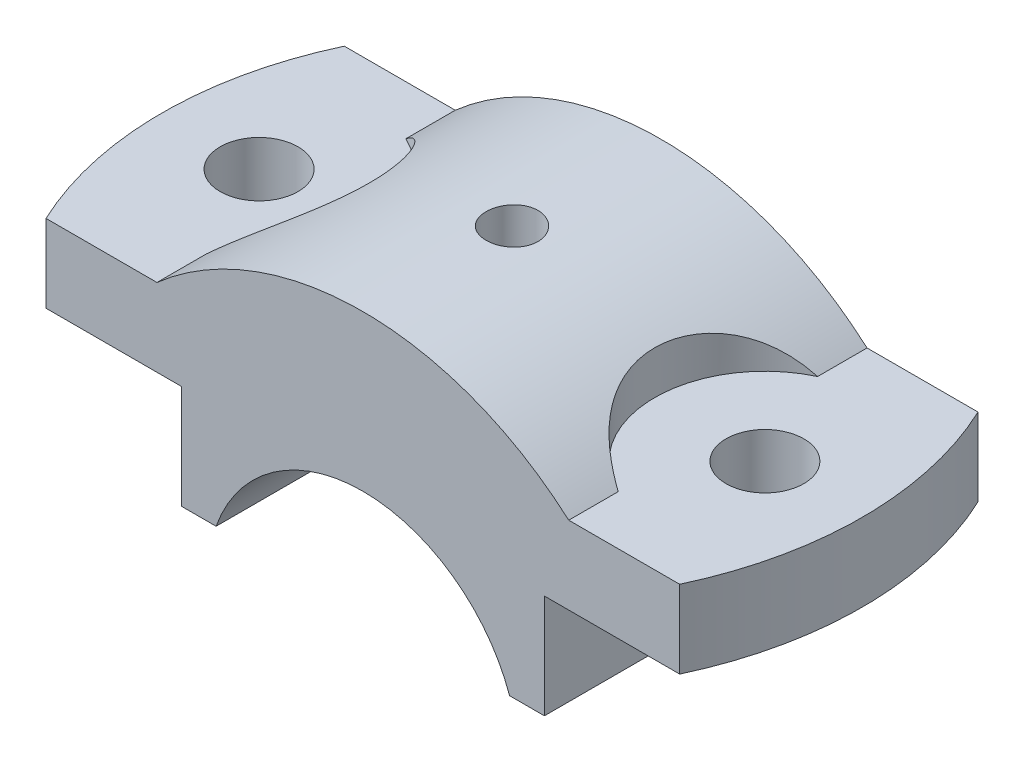
ISO-10303-21;
HEADER;
FILE_DESCRIPTION(('STEP AP214'),'2;1');
FILE_NAME('part.step','',(''),(''),'','','');
FILE_SCHEMA(('AUTOMOTIVE_DESIGN { 1 0 10303 214 1 1 1 1 }'));
ENDSEC;
DATA;
#1=APPLICATION_CONTEXT('core data for automotive mechanical design processes');
#2=APPLICATION_PROTOCOL_DEFINITION('international standard','automotive_design',2000,#1);
#3=PRODUCT_CONTEXT('',#1,'mechanical');
#4=PRODUCT('Part','Part','',(#3));
#5=PRODUCT_RELATED_PRODUCT_CATEGORY('part','',(#4));
#6=PRODUCT_DEFINITION_FORMATION('','',#4);
#7=PRODUCT_DEFINITION_CONTEXT('part definition',#1,'design');
#8=PRODUCT_DEFINITION('design','',#6,#7);
#9=PRODUCT_DEFINITION_SHAPE('','',#8);
#10=(LENGTH_UNIT() NAMED_UNIT(*) SI_UNIT(.MILLI.,.METRE.));
#11=(NAMED_UNIT(*) PLANE_ANGLE_UNIT() SI_UNIT($,.RADIAN.));
#12=(NAMED_UNIT(*) SI_UNIT($,.STERADIAN.) SOLID_ANGLE_UNIT());
#13=UNCERTAINTY_MEASURE_WITH_UNIT(LENGTH_MEASURE(1.E-05),#10,'distance_accuracy_value','');
#14=(GEOMETRIC_REPRESENTATION_CONTEXT(3) GLOBAL_UNCERTAINTY_ASSIGNED_CONTEXT((#13)) GLOBAL_UNIT_ASSIGNED_CONTEXT((#10,
#11,#12)) REPRESENTATION_CONTEXT('',''));
#15=CARTESIAN_POINT('',(0.,0.,0.));
#16=DIRECTION('',(0.,0.,1.));
#17=DIRECTION('',(1.,0.,0.));
#18=AXIS2_PLACEMENT_3D('',#15,#16,#17);
#19=CARTESIAN_POINT('',(0.,0.,23.));
#20=DIRECTION('',(0.,0.,-1.));
#21=DIRECTION('',(-1.,0.,0.));
#22=AXIS2_PLACEMENT_3D('',#19,#20,#21);
#23=CYLINDRICAL_SURFACE('',#22,48.0000000000001);
#24=CARTESIAN_POINT('',(0.,48.0000000000001,-4.));
#25=CARTESIAN_POINT('',(0.224264359684817,47.9999978164607,-3.99999020469488));
#26=CARTESIAN_POINT('',(0.448681388720902,47.9984115417359,-3.98107612075582));
#27=CARTESIAN_POINT('',(0.891306282801559,47.9922360931301,-3.90590259257969));
#28=CARTESIAN_POINT('',(1.10950682090092,47.9876435172678,-3.84960083878039));
#29=CARTESIAN_POINT('',(1.53322409005704,47.9759744498442,-3.70129138476253));
#30=CARTESIAN_POINT('',(1.73874792169846,47.9688993639395,-3.60930388756073));
#31=CARTESIAN_POINT('',(2.1313889336643,47.9530587097885,-3.39227027251202));
#32=CARTESIAN_POINT('',(2.31851003954155,47.9442935032544,-3.26723122608997));
#33=CARTESIAN_POINT('',(2.66955999986236,47.9260311946686,-2.98729973357602));
#34=CARTESIAN_POINT('',(2.83343548966464,47.9165324834631,-2.83234046425726));
#35=CARTESIAN_POINT('',(3.13288453414622,47.8978872321268,-2.49710841660027));
#36=CARTESIAN_POINT('',(3.26845684548602,47.8887407074816,-2.31683452678951));
#37=CARTESIAN_POINT('',(3.50763168956092,47.8718181064498,-1.93576753160389));
#38=CARTESIAN_POINT('',(3.61118733180617,47.8640440472037,-1.73494489838891));
#39=CARTESIAN_POINT('',(3.78308973509538,47.850764977931,-1.31868681777607));
#40=CARTESIAN_POINT('',(3.85143711804967,47.8452599278253,-1.103251628567));
#41=CARTESIAN_POINT('',(3.95082811927428,47.8371556826529,-0.66441843247529));
#42=CARTESIAN_POINT('',(3.9819586615591,47.8345497174488,-0.441040240029592));
#43=CARTESIAN_POINT('',(4.00630083206171,47.8325172928591,0.00778481578146288));
#44=CARTESIAN_POINT('',(3.99951317191816,47.8330907738025,0.233231640244011));
#45=CARTESIAN_POINT('',(3.94828345685939,47.8373462944655,0.679198662042085));
#46=CARTESIAN_POINT('',(3.90393587215223,47.8410205351142,0.899729796305649));
#47=CARTESIAN_POINT('',(3.77899194153176,47.8510513427747,1.33020746957181));
#48=CARTESIAN_POINT('',(3.69839524158714,47.857407935984,1.54015390517541));
#49=CARTESIAN_POINT('',(3.50313515260813,47.8720961882742,1.94380362351239));
#50=CARTESIAN_POINT('',(3.38842937902878,47.8804303020386,2.13748631035003));
#51=CARTESIAN_POINT('',(3.12823777565339,47.8981322745552,2.50288535527922));
#52=CARTESIAN_POINT('',(2.98275132249017,47.9075001542413,2.67460126838886));
#53=CARTESIAN_POINT('',(2.66459832890545,47.9262488164658,2.99174167712627));
#54=CARTESIAN_POINT('',(2.4918501175623,47.9356295510027,3.13708425651701));
#55=CARTESIAN_POINT('',(2.124362225487,47.9533196747934,3.39671889355421));
#56=CARTESIAN_POINT('',(1.92962253006135,47.9616290633315,3.51101093045423));
#57=CARTESIAN_POINT('',(1.52362637307141,47.9762418323856,3.70529505067482));
#58=CARTESIAN_POINT('',(1.3123681672363,47.9825450006978,3.78528350591262));
#59=CARTESIAN_POINT('',(0.879356276078327,47.992432696472,3.90863252980531));
#60=CARTESIAN_POINT('',(0.65760280867542,47.9960172803555,3.95199385862105));
#61=CARTESIAN_POINT('',(0.210605200657004,48.0000566777221,4.00075505616631));
#62=CARTESIAN_POINT('',(-0.0146265164607844,48.0005208196801,4.00626807242759));
#63=CARTESIAN_POINT('',(-0.462811010013214,47.9982919511481,3.97947255749074));
#64=CARTESIAN_POINT('',(-0.685763807685653,47.995598970107,3.94716437908216));
#65=CARTESIAN_POINT('',(-1.1227390248988,47.9873647136529,3.84573736555962));
#66=CARTESIAN_POINT('',(-1.33677370055889,47.9818274966969,3.77667097589676));
#67=CARTESIAN_POINT('',(-1.75021666032996,47.9685268044941,3.60374164887188));
#68=CARTESIAN_POINT('',(-1.94962471313253,47.9607632940497,3.499878161366));
#69=CARTESIAN_POINT('',(-2.32866887320763,47.9438570557453,3.26001860313458));
#70=CARTESIAN_POINT('',(-2.50825740208588,47.9347111287495,3.12394757442069));
#71=CARTESIAN_POINT('',(-2.84208437937449,47.916078345588,2.82364377179807));
#72=CARTESIAN_POINT('',(-2.99632238725753,47.9065914835011,2.65941050860293));
#73=CARTESIAN_POINT('',(-3.27545818182041,47.8883184486329,2.30695323120664));
#74=CARTESIAN_POINT('',(-3.40028213293455,47.879534074969,2.1186706352104));
#75=CARTESIAN_POINT('',(-3.61654025135807,47.8636860697729,1.72375094854634));
#76=CARTESIAN_POINT('',(-3.70797475203986,47.8566224210607,1.51711404116025));
#77=CARTESIAN_POINT('',(-3.85473270976226,47.8450257139577,1.09161283784305));
#78=CARTESIAN_POINT('',(-3.91010136579716,47.8404894891454,0.872764221142677));
#79=CARTESIAN_POINT('',(-3.98330307964061,47.8344506276341,0.428837200502303));
#80=CARTESIAN_POINT('',(-4.00113685827306,47.8329479326788,0.20375891628162));
#81=CARTESIAN_POINT('',(-3.99875425156372,47.8331471180078,-0.245504504083583));
#82=CARTESIAN_POINT('',(-3.97865387910956,47.8348392277228,-0.469690268945752));
#83=CARTESIAN_POINT('',(-3.90121545318012,47.8412166032923,-0.911490134203405));
#84=CARTESIAN_POINT('',(-3.84387734291051,47.8459018737119,-1.12910422457536));
#85=CARTESIAN_POINT('',(-3.69362044006825,47.8577350852682,-1.55159105306648));
#86=CARTESIAN_POINT('',(-3.60070373602613,47.8648828818476,-1.75646453826275));
#87=CARTESIAN_POINT('',(-3.381940235789,47.8808359950028,-2.14772336229467));
#88=CARTESIAN_POINT('',(-3.25609395645823,47.889641285562,-2.3341089912533));
#89=CARTESIAN_POINT('',(-2.97460776848979,47.9079492679473,-2.68369495605204));
#90=CARTESIAN_POINT('',(-2.81888197496584,47.9174539202298,-2.84682603462939));
#91=CARTESIAN_POINT('',(-2.48221290236986,47.9360718003872,-3.14470074081328));
#92=CARTESIAN_POINT('',(-2.30126353056437,47.945184932993,-3.27943748998406));
#93=CARTESIAN_POINT('',(-1.91893509211766,47.962009393691,-3.51687944167025));
#94=CARTESIAN_POINT('',(-1.71751862508215,47.9697180809242,-3.61952455462531));
#95=CARTESIAN_POINT('',(-1.30038300798293,47.982834100652,-3.78940721220512));
#96=CARTESIAN_POINT('',(-1.0846806216546,47.9882440771303,-3.85668545715242));
#97=CARTESIAN_POINT('',(-0.723088192386717,47.9947643093541,-3.93679033000819));
#98=CARTESIAN_POINT('',(-0.579523577753882,47.9967187550782,-3.96046245006995));
#99=CARTESIAN_POINT('',(-0.290660686004651,47.9993373063454,-3.99207043870882));
#100=CARTESIAN_POINT('',(-0.145362413492181,48.0000014153143,-4.00000634906587));
#101=CARTESIAN_POINT('',(0.,48.0000000000001,-4.));
#102=B_SPLINE_CURVE_WITH_KNOTS('',3,(#24,#25,#26,#27,#28,#29,#30,#31,#32,#33,#34,#35,#36,#37,
#38,#39,#40,#41,#42,#43,#44,#45,#46,#47,#48,#49,#50,#51,#52,#53,#54,#55,#56,#57,#58,#59,#60,#61,
#62,#63,#64,#65,#66,#67,#68,#69,#70,#71,#72,#73,#74,#75,#76,#77,#78,#79,#80,#81,#82,#83,#84,#85,
#86,#87,#88,#89,#90,#91,#92,#93,#94,#95,#96,#97,#98,#99,#100,#101),.UNSPECIFIED.,.T.,.F.,(4,2,2,
2,2,2,2,2,2,2,2,2,2,2,2,2,2,2,2,2,2,2,2,2,2,2,2,2,2,2,2,2,2,2,2,2,2,2,4),(0.,0.672262347200557,
1.34528675599134,2.01793069555582,2.69043083833673,3.36445067514306,4.03850011495726,
4.71353211804365,5.38855219711604,6.06199259326346,6.73542035050476,7.40715932441158,
8.07890485907995,8.75148862995597,9.42408602323441,10.098738037406,10.7733905023458,
11.448114303618,12.1228241013014,12.7955159722867,13.4682015685688,14.1399299612314,
14.8116689744549,15.4849869989971,16.15831672285,16.8333190596481,17.5083146567931,
18.1824626896371,18.8565977759503,19.5286745153011,20.2007522796936,20.8727905979009,
21.5448183683942,22.2188075465856,22.8929598092992,23.5683669225022,24.2429950636714,
24.6787394542665,25.1144826879498),.UNSPECIFIED.);
#103=CARTESIAN_POINT('',(0.,48.0000000000001,-4.));
#104=VERTEX_POINT('',#103);
#105=EDGE_CURVE('E11',#104,#104,#102,.T.);
#106=ORIENTED_EDGE('',*,*,#105,.T.);
#107=EDGE_LOOP('',(#106));
#108=FACE_BOUND('',#107,.T.);
#109=CARTESIAN_POINT('',(31.7490157327752,36.,-15.376060196177));
#110=CARTESIAN_POINT('',(31.5666993606049,36.1607910344816,-15.2900831270757));
#111=CARTESIAN_POINT('',(31.3842407385664,36.3192382806886,-15.200076432177));
#112=CARTESIAN_POINT('',(31.0194382984915,36.6312986785064,-15.011755230729));
#113=CARTESIAN_POINT('',(30.83709449581,36.7849112802083,-14.9134397837672));
#114=CARTESIAN_POINT('',(30.2906545114745,37.2384242405059,-14.6055515958542));
#115=CARTESIAN_POINT('',(29.9273932433293,37.5307855559239,-14.3831506648985));
#116=CARTESIAN_POINT('',(29.2055877678829,38.0952057641667,-13.9017498917579));
#117=CARTESIAN_POINT('',(28.8470773519233,38.3671527207169,-13.6425680163447));
#118=CARTESIAN_POINT('',(28.1414563178619,38.8876660950045,-13.087906778826));
#119=CARTESIAN_POINT('',(27.7943424142726,39.1362392903487,-12.7924379963693));
#120=CARTESIAN_POINT('',(27.114437272857,39.6103537782901,-12.1634340928704));
#121=CARTESIAN_POINT('',(26.7817440960143,39.8357484531289,-11.8296819039898));
#122=CARTESIAN_POINT('',(26.1381758530123,40.2609560521936,-11.1265718110928));
#123=CARTESIAN_POINT('',(25.8273031949564,40.4607661549158,-10.7572099878547));
#124=CARTESIAN_POINT('',(25.2335249148575,40.8337098769774,-9.98600624775005));
#125=CARTESIAN_POINT('',(24.9505424988563,41.0069175240426,-9.58425938846317));
#126=CARTESIAN_POINT('',(24.4165226257608,41.3271148139076,-8.75027197863385));
#127=CARTESIAN_POINT('',(24.165480267083,41.4741084809499,-8.31803612285607));
#128=CARTESIAN_POINT('',(23.7269538102758,41.7263466257883,-7.47873214327826));
#129=CARTESIAN_POINT('',(23.535471816767,41.8344606926747,-7.07460691096148));
#130=CARTESIAN_POINT('',(23.1835604410674,42.0305023424914,-6.24834535649122));
#131=CARTESIAN_POINT('',(23.0231288276401,42.1184313759743,-5.82621033115849));
#132=CARTESIAN_POINT('',(22.7354708993115,42.2744033380663,-4.96694066927124));
#133=CARTESIAN_POINT('',(22.608263014144,42.3424352319098,-4.52979785912661));
#134=CARTESIAN_POINT('',(22.3889311500727,42.4588178093571,-3.64423461983456));
#135=CARTESIAN_POINT('',(22.2968060905276,42.5071690991774,-3.19581453850978));
#136=CARTESIAN_POINT('',(22.1535573681311,42.5819913104556,-2.31986442510469));
#137=CARTESIAN_POINT('',(22.1002179585565,42.6096478774008,-1.89279604525945));
#138=CARTESIAN_POINT('',(22.0260840023336,42.6480173220227,-1.03510100849084));
#139=CARTESIAN_POINT('',(22.0052877863416,42.6587310688027,-0.604474535223552));
#140=CARTESIAN_POINT('',(21.9964874817101,42.663269454285,0.257033751988517));
#141=CARTESIAN_POINT('',(22.0084707600267,42.6571005994522,0.687915403597678));
#142=CARTESIAN_POINT('',(22.065059537599,42.6278566152432,1.54695674796885));
#143=CARTESIAN_POINT('',(22.1096651361626,42.6047814344012,1.97511643244073));
#144=CARTESIAN_POINT('',(22.2301596888934,42.5420325739506,2.81994764060087));
#145=CARTESIAN_POINT('',(22.3056259308811,42.5025830752487,3.23669621522384));
#146=CARTESIAN_POINT('',(22.4869158657054,42.4069464217796,4.06157204983062));
#147=CARTESIAN_POINT('',(22.5927390819871,42.3507595297617,4.46969944504489));
#148=CARTESIAN_POINT('',(22.8334963082055,42.2214412118202,5.27452238868218));
#149=CARTESIAN_POINT('',(22.968430619134,42.1483096106976,5.67121781885722));
#150=CARTESIAN_POINT('',(23.2658059297839,41.9848905587105,6.45050946606144));
#151=CARTESIAN_POINT('',(23.4282471429062,41.8946029747476,6.83310557367879));
#152=CARTESIAN_POINT('',(23.7802108235912,41.6958360657889,7.58497168737193));
#153=CARTESIAN_POINT('',(23.9699550727257,41.5872063549858,7.95409805630046));
#154=CARTESIAN_POINT('',(24.3731485080021,41.3521952355228,8.67324372694052));
#155=CARTESIAN_POINT('',(24.5865977528721,41.2258137828836,9.02326298131195));
#156=CARTESIAN_POINT('',(25.0346129932482,40.955299887438,9.70223622389589));
#157=CARTESIAN_POINT('',(25.269177410192,40.8111687712937,10.0311917836809));
#158=CARTESIAN_POINT('',(25.7566603032743,40.5052741270817,10.6665029899036));
#159=CARTESIAN_POINT('',(26.0095789285024,40.3435104557809,10.9728584527217));
#160=CARTESIAN_POINT('',(26.5418842805157,39.9954208539865,11.5742533465979));
#161=CARTESIAN_POINT('',(26.8219376643438,39.8083462352716,11.8682688661705));
#162=CARTESIAN_POINT('',(27.3955194624364,39.4158125971758,12.4296869015499));
#163=CARTESIAN_POINT('',(27.6890490642933,39.2103519560057,12.6970870652737));
#164=CARTESIAN_POINT('',(28.2863824379903,38.7816416595244,13.205005176795));
#165=CARTESIAN_POINT('',(28.5901897214681,38.5583858879777,13.4455138130625));
#166=CARTESIAN_POINT('',(29.2047776474053,38.0950011657593,13.8996257253554));
#167=CARTESIAN_POINT('',(29.515556781803,37.854875840591,14.113234755093));
#168=CARTESIAN_POINT('',(30.1465409740783,37.3543930550498,14.5175420543303));
#169=CARTESIAN_POINT('',(30.4668164417767,37.093760879056,14.7077886938376));
#170=CARTESIAN_POINT('',(31.1079315091615,36.5577863535064,15.0615091701432));
#171=CARTESIAN_POINT('',(31.4287665224092,36.282490555825,15.2250617322872));
#172=CARTESIAN_POINT('',(31.7490157327752,36.,15.376060196177));
#173=B_SPLINE_CURVE_WITH_KNOTS('',3,(#109,#110,#111,#112,#113,#114,#115,#116,#117,#118,#119,
#120,#121,#122,#123,#124,#125,#126,#127,#128,#129,#130,#131,#132,#133,#134,#135,#136,#137,#138,
#139,#140,#141,#142,#143,#144,#145,#146,#147,#148,#149,#150,#151,#152,#153,#154,#155,#156,#157,
#158,#159,#160,#161,#162,#163,#164,#165,#166,#167,#168,#169,#170,#171,#172),.UNSPECIFIED.,.F.,
.F.,(4,2,2,2,2,2,2,2,2,2,2,2,2,2,2,2,2,2,2,2,2,2,2,2,2,2,2,2,2,2,2,4),(0.,0.773458025682371,
1.5470037114875,3.09512332277503,4.65119082007949,6.20680570955186,7.77172305062617,
9.33681282467531,10.8974652129592,12.4578778108564,13.8363264835487,15.2146760660573,
16.5937886249588,17.9728587002062,19.2651269606079,20.5573289303254,21.8490329624022,
23.1407409266611,24.4153187748839,25.6898766154092,26.9644476347566,28.2390285427914,
29.5246179289053,30.8102105000726,32.0957070405174,33.3812140241151,34.7209972321289,
36.0608987360841,37.4012627703215,38.7413396176215,40.1042161588981,41.4629977344697),.UNSPECIFIED.);
#174=CARTESIAN_POINT('',(31.7490157327752,36.,-15.376060196177));
#175=VERTEX_POINT('',#174);
#176=CARTESIAN_POINT('',(31.7490157327752,36.,15.376060196177));
#177=VERTEX_POINT('',#176);
#178=EDGE_CURVE('E139',#175,#177,#173,.T.);
#179=ORIENTED_EDGE('',*,*,#178,.F.);
#180=DIRECTION('',(0.,0.,-1.));
#181=VECTOR('',#180,1.);
#182=CARTESIAN_POINT('',(31.7490157327752,36.,23.));
#183=LINE('',#182,#181);
#184=CARTESIAN_POINT('',(31.7490157327752,36.,-23.));
#185=VERTEX_POINT('',#184);
#186=EDGE_CURVE('E146',#175,#185,#183,.T.);
#187=ORIENTED_EDGE('',*,*,#186,.T.);
#188=CARTESIAN_POINT('',(0.,0.,-23.));
#189=DIRECTION('',(0.,0.,1.));
#190=DIRECTION('',(-1.,0.,0.));
#191=AXIS2_PLACEMENT_3D('',#188,#189,#190);
#192=CIRCLE('',#191,48.0000000000001);
#193=CARTESIAN_POINT('',(-31.7490157327752,36.,-23.));
#194=VERTEX_POINT('',#193);
#195=EDGE_CURVE('E311',#185,#194,#192,.T.);
#196=ORIENTED_EDGE('',*,*,#195,.T.);
#197=DIRECTION('',(0.,0.,-1.));
#198=VECTOR('',#197,1.);
#199=CARTESIAN_POINT('',(-31.7490157327752,36.,23.));
#200=LINE('',#199,#198);
#201=CARTESIAN_POINT('',(-31.7490157327752,36.,-15.376060196177));
#202=VERTEX_POINT('',#201);
#203=EDGE_CURVE('E162',#202,#194,#200,.T.);
#204=ORIENTED_EDGE('',*,*,#203,.F.);
#205=CARTESIAN_POINT('',(-31.7490157327752,36.,-15.376060196177));
#206=CARTESIAN_POINT('',(-31.5666993606049,36.1607910344816,-15.2900831270757));
#207=CARTESIAN_POINT('',(-31.3842407385664,36.3192382806886,-15.200076432177));
#208=CARTESIAN_POINT('',(-31.0194382984915,36.6312986785064,-15.011755230729));
#209=CARTESIAN_POINT('',(-30.8370944958101,36.7849112802083,-14.9134397837672));
#210=CARTESIAN_POINT('',(-30.2906545114745,37.2384242405059,-14.6055515958542));
#211=CARTESIAN_POINT('',(-29.9273932433293,37.5307855559239,-14.3831506648985));
#212=CARTESIAN_POINT('',(-29.2055877678829,38.0952057641667,-13.9017498917579));
#213=CARTESIAN_POINT('',(-28.8470773519233,38.3671527207169,-13.6425680163447));
#214=CARTESIAN_POINT('',(-28.1414563178619,38.8876660950044,-13.087906778826));
#215=CARTESIAN_POINT('',(-27.7943424142726,39.1362392903486,-12.7924379963693));
#216=CARTESIAN_POINT('',(-27.114437272857,39.6103537782901,-12.1634340928704));
#217=CARTESIAN_POINT('',(-26.7817440960144,39.8357484531289,-11.8296819039898));
#218=CARTESIAN_POINT('',(-26.1381758530123,40.2609560521935,-11.1265718110929));
#219=CARTESIAN_POINT('',(-25.8273031949564,40.4607661549158,-10.7572099878547));
#220=CARTESIAN_POINT('',(-25.2335249148576,40.8337098769774,-9.98600624775007));
#221=CARTESIAN_POINT('',(-24.9505424988563,41.0069175240426,-9.58425938846318));
#222=CARTESIAN_POINT('',(-24.4165226257608,41.3271148139076,-8.75027197863387));
#223=CARTESIAN_POINT('',(-24.165480267083,41.4741084809499,-8.31803612285608));
#224=CARTESIAN_POINT('',(-23.7269538102758,41.7263466257883,-7.47873214327827));
#225=CARTESIAN_POINT('',(-23.5354718167671,41.8344606926747,-7.07460691096149));
#226=CARTESIAN_POINT('',(-23.1835604410675,42.0305023424914,-6.24834535649123));
#227=CARTESIAN_POINT('',(-23.0231288276401,42.1184313759743,-5.82621033115851));
#228=CARTESIAN_POINT('',(-22.7354708993115,42.2744033380663,-4.96694066927125));
#229=CARTESIAN_POINT('',(-22.608263014144,42.3424352319098,-4.52979785912662));
#230=CARTESIAN_POINT('',(-22.3889311500727,42.4588178093571,-3.64423461983457));
#231=CARTESIAN_POINT('',(-22.2968060905276,42.5071690991774,-3.19581453850979));
#232=CARTESIAN_POINT('',(-22.1535573681311,42.5819913104556,-2.31986442510471));
#233=CARTESIAN_POINT('',(-22.1002179585565,42.6096478774008,-1.89279604525946));
#234=CARTESIAN_POINT('',(-22.0260840023336,42.6480173220227,-1.03510100849086));
#235=CARTESIAN_POINT('',(-22.0052877863416,42.6587310688027,-0.604474535223566));
#236=CARTESIAN_POINT('',(-21.9964874817101,42.663269454285,0.257033751988505));
#237=CARTESIAN_POINT('',(-22.0084707600267,42.6571005994522,0.687915403597665));
#238=CARTESIAN_POINT('',(-22.065059537599,42.6278566152432,1.54695674796884));
#239=CARTESIAN_POINT('',(-22.1096651361626,42.6047814344013,1.97511643244072));
#240=CARTESIAN_POINT('',(-22.2301596888934,42.5420325739506,2.81994764060086));
#241=CARTESIAN_POINT('',(-22.305625930881,42.5025830752487,3.23669621522383));
#242=CARTESIAN_POINT('',(-22.4869158657054,42.4069464217796,4.0615720498306));
#243=CARTESIAN_POINT('',(-22.5927390819871,42.3507595297616,4.46969944504488));
#244=CARTESIAN_POINT('',(-22.8334963082055,42.2214412118202,5.27452238868217));
#245=CARTESIAN_POINT('',(-22.968430619134,42.1483096106976,5.67121781885721));
#246=CARTESIAN_POINT('',(-23.2658059297839,41.9848905587105,6.45050946606143));
#247=CARTESIAN_POINT('',(-23.4282471429062,41.8946029747476,6.83310557367878));
#248=CARTESIAN_POINT('',(-23.7802108235912,41.6958360657888,7.58497168737192));
#249=CARTESIAN_POINT('',(-23.9699550727257,41.5872063549858,7.95409805630045));
#250=CARTESIAN_POINT('',(-24.3731485080021,41.3521952355228,8.67324372694051));
#251=CARTESIAN_POINT('',(-24.5865977528721,41.2258137828836,9.02326298131194));
#252=CARTESIAN_POINT('',(-25.0346129932482,40.955299887438,9.70223622389589));
#253=CARTESIAN_POINT('',(-25.269177410192,40.8111687712937,10.0311917836809));
#254=CARTESIAN_POINT('',(-25.7566603032743,40.5052741270817,10.6665029899036));
#255=CARTESIAN_POINT('',(-26.0095789285024,40.3435104557809,10.9728584527217));
#256=CARTESIAN_POINT('',(-26.5418842805157,39.9954208539865,11.5742533465979));
#257=CARTESIAN_POINT('',(-26.8219376643438,39.8083462352716,11.8682688661705));
#258=CARTESIAN_POINT('',(-27.3955194624364,39.4158125971758,12.4296869015499));
#259=CARTESIAN_POINT('',(-27.6890490642933,39.2103519560057,12.6970870652737));
#260=CARTESIAN_POINT('',(-28.2863824379903,38.7816416595244,13.205005176795));
#261=CARTESIAN_POINT('',(-28.5901897214681,38.5583858879777,13.4455138130625));
#262=CARTESIAN_POINT('',(-29.2047776474053,38.0950011657593,13.8996257253553));
#263=CARTESIAN_POINT('',(-29.515556781803,37.854875840591,14.113234755093));
#264=CARTESIAN_POINT('',(-30.1465409740783,37.3543930550498,14.5175420543303));
#265=CARTESIAN_POINT('',(-30.4668164417767,37.093760879056,14.7077886938376));
#266=CARTESIAN_POINT('',(-31.1079315091615,36.5577863535064,15.0615091701432));
#267=CARTESIAN_POINT('',(-31.4287665224092,36.282490555825,15.2250617322872));
#268=CARTESIAN_POINT('',(-31.7490157327752,36.,15.376060196177));
#269=B_SPLINE_CURVE_WITH_KNOTS('',3,(#205,#206,#207,#208,#209,#210,#211,#212,#213,#214,#215,
#216,#217,#218,#219,#220,#221,#222,#223,#224,#225,#226,#227,#228,#229,#230,#231,#232,#233,#234,
#235,#236,#237,#238,#239,#240,#241,#242,#243,#244,#245,#246,#247,#248,#249,#250,#251,#252,#253,
#254,#255,#256,#257,#258,#259,#260,#261,#262,#263,#264,#265,#266,#267,#268),.UNSPECIFIED.,.F.,
.F.,(4,2,2,2,2,2,2,2,2,2,2,2,2,2,2,2,2,2,2,2,2,2,2,2,2,2,2,2,2,2,2,4),(0.,0.773458025682371,
1.5470037114875,3.09512332277503,4.65119082007949,6.20680570955186,7.77172305062616,
9.33681282467531,10.8974652129592,12.4578778108564,13.8363264835487,15.2146760660573,
16.5937886249588,17.9728587002062,19.2651269606079,20.5573289303254,21.8490329624022,
23.1407409266611,24.4153187748839,25.6898766154092,26.9644476347566,28.2390285427914,
29.5246179289053,30.8102105000726,32.0957070405174,33.3812140241151,34.7209972321289,
36.0608987360841,37.4012627703214,38.7413396176214,40.1042161588981,41.4629977344698),.UNSPECIFIED.);
#270=CARTESIAN_POINT('',(-31.7490157327752,36.,15.376060196177));
#271=VERTEX_POINT('',#270);
#272=EDGE_CURVE('E190',#202,#271,#269,.T.);
#273=ORIENTED_EDGE('',*,*,#272,.T.);
#274=CARTESIAN_POINT('',(-31.7490157327752,36.,23.));
#275=VERTEX_POINT('',#274);
#276=EDGE_CURVE('E158',#275,#271,#200,.T.);
#277=ORIENTED_EDGE('',*,*,#276,.F.);
#278=CARTESIAN_POINT('',(0.,0.,23.));
#279=DIRECTION('',(0.,0.,1.));
#280=DIRECTION('',(-1.,0.,0.));
#281=AXIS2_PLACEMENT_3D('',#278,#279,#280);
#282=CIRCLE('',#281,48.0000000000001);
#283=CARTESIAN_POINT('',(31.7490157327752,36.,23.));
#284=VERTEX_POINT('',#283);
#285=EDGE_CURVE('E328',#284,#275,#282,.T.);
#286=ORIENTED_EDGE('',*,*,#285,.F.);
#287=EDGE_CURVE('E149',#284,#177,#183,.T.);
#288=ORIENTED_EDGE('',*,*,#287,.T.);
#289=EDGE_LOOP('',(#179,#187,#196,#204,#273,#277,#286,#288));
#290=FACE_BOUND('',#289,.T.);
#291=ADVANCED_FACE('F33',(#108,#290),#23,.T.);
#292=CARTESIAN_POINT('',(54.,24.,23.));
#293=DIRECTION('',(0.,1.,0.));
#294=DIRECTION('',(0.,0.,1.));
#295=AXIS2_PLACEMENT_3D('',#292,#293,#294);
#296=PLANE('',#295);
#297=CARTESIAN_POINT('',(39.,24.,0.));
#298=DIRECTION('',(0.,1.,0.));
#299=DIRECTION('',(0.,0.,1.));
#300=AXIS2_PLACEMENT_3D('',#297,#298,#299);
#301=CIRCLE('',#300,5.99999999999999);
#302=CARTESIAN_POINT('',(39.,24.,5.99999999999999));
#303=VERTEX_POINT('',#302);
#304=EDGE_CURVE('E379',#303,#303,#301,.F.);
#305=ORIENTED_EDGE('',*,*,#304,.F.);
#306=EDGE_LOOP('',(#305));
#307=FACE_BOUND('',#306,.T.);
#308=CARTESIAN_POINT('',(0.,24.,0.));
#309=DIRECTION('',(0.,1.,0.));
#310=DIRECTION('',(0.,0.,1.));
#311=AXIS2_PLACEMENT_3D('',#308,#309,#310);
#312=CIRCLE('',#311,54.);
#313=CARTESIAN_POINT('',(48.8569340012244,24.,23.));
#314=VERTEX_POINT('',#313);
#315=CARTESIAN_POINT('',(48.8569340012244,24.,-23.));
#316=VERTEX_POINT('',#315);
#317=EDGE_CURVE('E60',#314,#316,#312,.T.);
#318=ORIENTED_EDGE('',*,*,#317,.F.);
#319=DIRECTION('',(1.,0.,0.));
#320=VECTOR('',#319,1.);
#321=CARTESIAN_POINT('',(54.,24.,23.));
#322=LINE('',#321,#320);
#323=CARTESIAN_POINT('',(28.,24.,23.));
#324=VERTEX_POINT('',#323);
#325=EDGE_CURVE('E354',#324,#314,#322,.T.);
#326=ORIENTED_EDGE('',*,*,#325,.F.);
#327=DIRECTION('',(0.,0.,-1.));
#328=VECTOR('',#327,1.);
#329=CARTESIAN_POINT('',(28.,24.,23.));
#330=LINE('',#329,#328);
#331=CARTESIAN_POINT('',(28.,24.,-23.));
#332=VERTEX_POINT('',#331);
#333=EDGE_CURVE('E160',#324,#332,#330,.T.);
#334=ORIENTED_EDGE('',*,*,#333,.T.);
#335=DIRECTION('',(1.,0.,0.));
#336=VECTOR('',#335,1.);
#337=CARTESIAN_POINT('',(54.,24.,-23.));
#338=LINE('',#337,#336);
#339=EDGE_CURVE('E307',#332,#316,#338,.T.);
#340=ORIENTED_EDGE('',*,*,#339,.T.);
#341=EDGE_LOOP('',(#318,#326,#334,#340));
#342=FACE_BOUND('',#341,.T.);
#343=ADVANCED_FACE('F238',(#307,#342),#296,.F.);
#344=CARTESIAN_POINT('',(31.7490157327752,36.,23.));
#345=DIRECTION('',(0.,-1.,0.));
#346=DIRECTION('',(0.,0.,-1.));
#347=AXIS2_PLACEMENT_3D('',#344,#345,#346);
#348=PLANE('',#347);
#349=CARTESIAN_POINT('',(39.,36.,0.));
#350=DIRECTION('',(0.,-1.,0.));
#351=DIRECTION('',(0.,0.,1.));
#352=AXIS2_PLACEMENT_3D('',#349,#350,#351);
#353=CIRCLE('',#352,5.99999999999999);
#354=CARTESIAN_POINT('',(39.,36.,5.99999999999999));
#355=VERTEX_POINT('',#354);
#356=EDGE_CURVE('E373',#355,#355,#353,.T.);
#357=ORIENTED_EDGE('',*,*,#356,.T.);
#358=EDGE_LOOP('',(#357));
#359=FACE_BOUND('',#358,.T.);
#360=DIRECTION('',(-1.,0.,0.));
#361=VECTOR('',#360,1.);
#362=CARTESIAN_POINT('',(31.7490157327752,36.,23.));
#363=LINE('',#362,#361);
#364=CARTESIAN_POINT('',(48.8569340012244,36.,23.));
#365=VERTEX_POINT('',#364);
#366=EDGE_CURVE('E357',#365,#284,#363,.T.);
#367=ORIENTED_EDGE('',*,*,#366,.F.);
#368=CARTESIAN_POINT('',(0.,36.,0.));
#369=DIRECTION('',(0.,-1.,0.));
#370=DIRECTION('',(0.,0.,1.));
#371=AXIS2_PLACEMENT_3D('',#368,#369,#370);
#372=CIRCLE('',#371,54.);
#373=CARTESIAN_POINT('',(48.8569340012244,36.,-23.));
#374=VERTEX_POINT('',#373);
#375=EDGE_CURVE('E141',#365,#374,#372,.F.);
#376=ORIENTED_EDGE('',*,*,#375,.T.);
#377=DIRECTION('',(-1.,0.,0.));
#378=VECTOR('',#377,1.);
#379=CARTESIAN_POINT('',(31.7490157327752,36.,-23.));
#380=LINE('',#379,#378);
#381=EDGE_CURVE('E156',#374,#185,#380,.T.);
#382=ORIENTED_EDGE('',*,*,#381,.T.);
#383=ORIENTED_EDGE('',*,*,#186,.F.);
#384=CARTESIAN_POINT('',(39.,36.,0.));
#385=DIRECTION('',(0.,-1.,0.));
#386=DIRECTION('',(0.,0.,1.));
#387=AXIS2_PLACEMENT_3D('',#384,#385,#386);
#388=CIRCLE('',#387,17.);
#389=EDGE_CURVE('E52',#175,#177,#388,.F.);
#390=ORIENTED_EDGE('',*,*,#389,.T.);
#391=ORIENTED_EDGE('',*,*,#287,.F.);
#392=EDGE_LOOP('',(#367,#376,#382,#383,#390,#391));
#393=FACE_BOUND('',#392,.T.);
#394=ADVANCED_FACE('F153',(#359,#393),#348,.F.);
#395=CARTESIAN_POINT('',(0.,0.,23.));
#396=DIRECTION('',(0.,0.,-1.));
#397=DIRECTION('',(-1.,0.,0.));
#398=AXIS2_PLACEMENT_3D('',#395,#396,#397);
#399=PLANE('',#398);
#400=DIRECTION('',(0.,1.,0.));
#401=VECTOR('',#400,1.);
#402=CARTESIAN_POINT('',(48.8569340012244,8.,23.));
#403=LINE('',#402,#401);
#404=EDGE_CURVE('E150',#365,#314,#403,.F.);
#405=ORIENTED_EDGE('',*,*,#404,.F.);
#406=ORIENTED_EDGE('',*,*,#366,.T.);
#407=ORIENTED_EDGE('',*,*,#285,.T.);
#408=DIRECTION('',(-1.,0.,0.));
#409=VECTOR('',#408,1.);
#410=CARTESIAN_POINT('',(-54.,36.,23.));
#411=LINE('',#410,#409);
#412=CARTESIAN_POINT('',(-48.8569340012244,36.,23.));
#413=VERTEX_POINT('',#412);
#414=EDGE_CURVE('E323',#275,#413,#411,.T.);
#415=ORIENTED_EDGE('',*,*,#414,.T.);
#416=DIRECTION('',(0.,1.,0.));
#417=VECTOR('',#416,1.);
#418=CARTESIAN_POINT('',(-48.8569340012244,8.,23.));
#419=LINE('',#418,#417);
#420=CARTESIAN_POINT('',(-48.8569340012244,24.,23.));
#421=VERTEX_POINT('',#420);
#422=EDGE_CURVE('E187',#413,#421,#419,.F.);
#423=ORIENTED_EDGE('',*,*,#422,.T.);
#424=DIRECTION('',(1.,0.,0.));
#425=VECTOR('',#424,1.);
#426=CARTESIAN_POINT('',(-28.,24.,23.));
#427=LINE('',#426,#425);
#428=CARTESIAN_POINT('',(-28.,24.,23.));
#429=VERTEX_POINT('',#428);
#430=EDGE_CURVE('E320',#421,#429,#427,.T.);
#431=ORIENTED_EDGE('',*,*,#430,.T.);
#432=DIRECTION('',(0.,-1.,0.));
#433=VECTOR('',#432,1.);
#434=CARTESIAN_POINT('',(-28.,8.,23.));
#435=LINE('',#434,#433);
#436=CARTESIAN_POINT('',(-28.,8.,23.));
#437=VERTEX_POINT('',#436);
#438=EDGE_CURVE('E317',#429,#437,#435,.T.);
#439=ORIENTED_EDGE('',*,*,#438,.T.);
#440=DIRECTION('',(1.,0.,0.));
#441=VECTOR('',#440,1.);
#442=CARTESIAN_POINT('',(-22.6274169979695,8.,23.));
#443=LINE('',#442,#441);
#444=CARTESIAN_POINT('',(-22.6274169979695,8.,23.));
#445=VERTEX_POINT('',#444);
#446=EDGE_CURVE('E347',#437,#445,#443,.T.);
#447=ORIENTED_EDGE('',*,*,#446,.T.);
#448=CARTESIAN_POINT('',(0.,0.,23.));
#449=DIRECTION('',(0.,0.,-1.));
#450=DIRECTION('',(1.,0.,0.));
#451=AXIS2_PLACEMENT_3D('',#448,#449,#450);
#452=CIRCLE('',#451,24.);
#453=CARTESIAN_POINT('',(22.6274169979695,8.,23.));
#454=VERTEX_POINT('',#453);
#455=EDGE_CURVE('E297',#445,#454,#452,.T.);
#456=ORIENTED_EDGE('',*,*,#455,.T.);
#457=DIRECTION('',(1.,0.,0.));
#458=VECTOR('',#457,1.);
#459=CARTESIAN_POINT('',(28.,8.,23.));
#460=LINE('',#459,#458);
#461=CARTESIAN_POINT('',(28.,8.,23.));
#462=VERTEX_POINT('',#461);
#463=EDGE_CURVE('E350',#454,#462,#460,.T.);
#464=ORIENTED_EDGE('',*,*,#463,.T.);
#465=DIRECTION('',(0.,1.,0.));
#466=VECTOR('',#465,1.);
#467=CARTESIAN_POINT('',(28.,24.,23.));
#468=LINE('',#467,#466);
#469=EDGE_CURVE('E352',#462,#324,#468,.T.);
#470=ORIENTED_EDGE('',*,*,#469,.T.);
#471=ORIENTED_EDGE('',*,*,#325,.T.);
#472=EDGE_LOOP('',(#405,#406,#407,#415,#423,#431,#439,#447,#456,#464,#470,#471));
#473=FACE_BOUND('',#472,.T.);
#474=ADVANCED_FACE('F219',(#473),#399,.F.);
#475=CARTESIAN_POINT('',(0.,0.,-23.));
#476=DIRECTION('',(0.,0.,-1.));
#477=DIRECTION('',(-1.,0.,0.));
#478=AXIS2_PLACEMENT_3D('',#475,#476,#477);
#479=PLANE('',#478);
#480=ORIENTED_EDGE('',*,*,#381,.F.);
#481=DIRECTION('',(0.,1.,0.));
#482=VECTOR('',#481,1.);
#483=CARTESIAN_POINT('',(48.8569340012244,8.,-23.));
#484=LINE('',#483,#482);
#485=EDGE_CURVE('E197',#374,#316,#484,.F.);
#486=ORIENTED_EDGE('',*,*,#485,.T.);
#487=ORIENTED_EDGE('',*,*,#339,.F.);
#488=DIRECTION('',(0.,1.,0.));
#489=VECTOR('',#488,1.);
#490=CARTESIAN_POINT('',(28.,24.,-23.));
#491=LINE('',#490,#489);
#492=CARTESIAN_POINT('',(28.,8.,-23.));
#493=VERTEX_POINT('',#492);
#494=EDGE_CURVE('E302',#493,#332,#491,.T.);
#495=ORIENTED_EDGE('',*,*,#494,.F.);
#496=DIRECTION('',(1.,0.,0.));
#497=VECTOR('',#496,1.);
#498=CARTESIAN_POINT('',(28.,8.,-23.));
#499=LINE('',#498,#497);
#500=CARTESIAN_POINT('',(22.6274169979695,8.,-23.));
#501=VERTEX_POINT('',#500);
#502=EDGE_CURVE('E300',#501,#493,#499,.T.);
#503=ORIENTED_EDGE('',*,*,#502,.F.);
#504=CARTESIAN_POINT('',(0.,0.,-23.));
#505=DIRECTION('',(0.,0.,-1.));
#506=DIRECTION('',(1.,0.,0.));
#507=AXIS2_PLACEMENT_3D('',#504,#505,#506);
#508=CIRCLE('',#507,24.);
#509=CARTESIAN_POINT('',(-22.6274169979695,8.,-23.));
#510=VERTEX_POINT('',#509);
#511=EDGE_CURVE('E293',#510,#501,#508,.T.);
#512=ORIENTED_EDGE('',*,*,#511,.F.);
#513=DIRECTION('',(1.,0.,0.));
#514=VECTOR('',#513,1.);
#515=CARTESIAN_POINT('',(-22.6274169979695,8.,-23.));
#516=LINE('',#515,#514);
#517=CARTESIAN_POINT('',(-28.,8.,-23.));
#518=VERTEX_POINT('',#517);
#519=EDGE_CURVE('E287',#518,#510,#516,.T.);
#520=ORIENTED_EDGE('',*,*,#519,.F.);
#521=DIRECTION('',(0.,-1.,0.));
#522=VECTOR('',#521,1.);
#523=CARTESIAN_POINT('',(-28.,8.,-23.));
#524=LINE('',#523,#522);
#525=CARTESIAN_POINT('',(-28.,24.,-23.));
#526=VERTEX_POINT('',#525);
#527=EDGE_CURVE('E184',#526,#518,#524,.T.);
#528=ORIENTED_EDGE('',*,*,#527,.F.);
#529=DIRECTION('',(1.,0.,0.));
#530=VECTOR('',#529,1.);
#531=CARTESIAN_POINT('',(-28.,24.,-23.));
#532=LINE('',#531,#530);
#533=CARTESIAN_POINT('',(-48.8569340012244,24.,-23.));
#534=VERTEX_POINT('',#533);
#535=EDGE_CURVE('E316',#534,#526,#532,.T.);
#536=ORIENTED_EDGE('',*,*,#535,.F.);
#537=DIRECTION('',(0.,1.,0.));
#538=VECTOR('',#537,1.);
#539=CARTESIAN_POINT('',(-48.8569340012244,8.,-23.));
#540=LINE('',#539,#538);
#541=CARTESIAN_POINT('',(-48.8569340012244,36.,-23.));
#542=VERTEX_POINT('',#541);
#543=EDGE_CURVE('E180',#542,#534,#540,.F.);
#544=ORIENTED_EDGE('',*,*,#543,.F.);
#545=DIRECTION('',(-1.,0.,0.));
#546=VECTOR('',#545,1.);
#547=CARTESIAN_POINT('',(-54.,36.,-23.));
#548=LINE('',#547,#546);
#549=EDGE_CURVE('E313',#194,#542,#548,.T.);
#550=ORIENTED_EDGE('',*,*,#549,.F.);
#551=ORIENTED_EDGE('',*,*,#195,.F.);
#552=EDGE_LOOP('',(#480,#486,#487,#495,#503,#512,#520,#528,#536,#544,#550,#551));
#553=FACE_BOUND('',#552,.T.);
#554=ADVANCED_FACE('F222',(#553),#479,.T.);
#555=CARTESIAN_POINT('',(-54.,36.,23.));
#556=DIRECTION('',(0.,-1.,0.));
#557=DIRECTION('',(0.,0.,-1.));
#558=AXIS2_PLACEMENT_3D('',#555,#556,#557);
#559=PLANE('',#558);
#560=CARTESIAN_POINT('',(-39.,36.,0.));
#561=DIRECTION('',(0.,1.,0.));
#562=DIRECTION('',(0.,0.,1.));
#563=AXIS2_PLACEMENT_3D('',#560,#561,#562);
#564=CIRCLE('',#563,5.99999999999999);
#565=CARTESIAN_POINT('',(-39.,36.,5.99999999999999));
#566=VERTEX_POINT('',#565);
#567=EDGE_CURVE('E185',#566,#566,#564,.T.);
#568=ORIENTED_EDGE('',*,*,#567,.F.);
#569=EDGE_LOOP('',(#568));
#570=FACE_BOUND('',#569,.T.);
#571=CARTESIAN_POINT('',(0.,36.,0.));
#572=DIRECTION('',(0.,1.,0.));
#573=DIRECTION('',(0.,0.,1.));
#574=AXIS2_PLACEMENT_3D('',#571,#572,#573);
#575=CIRCLE('',#574,54.);
#576=EDGE_CURVE('E338',#413,#542,#575,.F.);
#577=ORIENTED_EDGE('',*,*,#576,.F.);
#578=ORIENTED_EDGE('',*,*,#414,.F.);
#579=ORIENTED_EDGE('',*,*,#276,.T.);
#580=CARTESIAN_POINT('',(-39.,36.,0.));
#581=DIRECTION('',(0.,1.,0.));
#582=DIRECTION('',(0.,0.,1.));
#583=AXIS2_PLACEMENT_3D('',#580,#581,#582);
#584=CIRCLE('',#583,17.);
#585=EDGE_CURVE('E342',#202,#271,#584,.F.);
#586=ORIENTED_EDGE('',*,*,#585,.F.);
#587=ORIENTED_EDGE('',*,*,#203,.T.);
#588=ORIENTED_EDGE('',*,*,#549,.T.);
#589=EDGE_LOOP('',(#577,#578,#579,#586,#587,#588));
#590=FACE_BOUND('',#589,.T.);
#591=ADVANCED_FACE('F226',(#570,#590),#559,.F.);
#592=CARTESIAN_POINT('',(-28.,24.,23.));
#593=DIRECTION('',(0.,1.,0.));
#594=DIRECTION('',(0.,0.,1.));
#595=AXIS2_PLACEMENT_3D('',#592,#593,#594);
#596=PLANE('',#595);
#597=CARTESIAN_POINT('',(-39.,24.,0.));
#598=DIRECTION('',(0.,1.,0.));
#599=DIRECTION('',(0.,0.,1.));
#600=AXIS2_PLACEMENT_3D('',#597,#598,#599);
#601=CIRCLE('',#600,5.99999999999999);
#602=CARTESIAN_POINT('',(-39.,24.,5.99999999999999));
#603=VERTEX_POINT('',#602);
#604=EDGE_CURVE('E181',#603,#603,#601,.T.);
#605=ORIENTED_EDGE('',*,*,#604,.T.);
#606=EDGE_LOOP('',(#605));
#607=FACE_BOUND('',#606,.T.);
#608=ORIENTED_EDGE('',*,*,#430,.F.);
#609=CARTESIAN_POINT('',(0.,24.,0.));
#610=DIRECTION('',(0.,1.,0.));
#611=DIRECTION('',(0.,0.,1.));
#612=AXIS2_PLACEMENT_3D('',#609,#610,#611);
#613=CIRCLE('',#612,54.);
#614=EDGE_CURVE('E336',#421,#534,#613,.F.);
#615=ORIENTED_EDGE('',*,*,#614,.T.);
#616=ORIENTED_EDGE('',*,*,#535,.T.);
#617=DIRECTION('',(0.,0.,-1.));
#618=VECTOR('',#617,1.);
#619=CARTESIAN_POINT('',(-28.,24.,23.));
#620=LINE('',#619,#618);
#621=EDGE_CURVE('E318',#429,#526,#620,.T.);
#622=ORIENTED_EDGE('',*,*,#621,.F.);
#623=EDGE_LOOP('',(#608,#615,#616,#622));
#624=FACE_BOUND('',#623,.T.);
#625=ADVANCED_FACE('F228',(#607,#624),#596,.F.);
#626=CARTESIAN_POINT('',(-28.,8.,23.));
#627=DIRECTION('',(1.,0.,0.));
#628=DIRECTION('',(0.,1.,0.));
#629=AXIS2_PLACEMENT_3D('',#626,#627,#628);
#630=PLANE('',#629);
#631=ORIENTED_EDGE('',*,*,#527,.T.);
#632=DIRECTION('',(0.,0.,-1.));
#633=VECTOR('',#632,1.);
#634=CARTESIAN_POINT('',(-28.,8.,23.));
#635=LINE('',#634,#633);
#636=EDGE_CURVE('E177',#437,#518,#635,.T.);
#637=ORIENTED_EDGE('',*,*,#636,.F.);
#638=ORIENTED_EDGE('',*,*,#438,.F.);
#639=ORIENTED_EDGE('',*,*,#621,.T.);
#640=EDGE_LOOP('',(#631,#637,#638,#639));
#641=FACE_BOUND('',#640,.T.);
#642=ADVANCED_FACE('F35',(#641),#630,.F.);
#643=CARTESIAN_POINT('',(-22.6274169979695,8.,23.));
#644=DIRECTION('',(0.,1.,0.));
#645=DIRECTION('',(0.,0.,1.));
#646=AXIS2_PLACEMENT_3D('',#643,#644,#645);
#647=PLANE('',#646);
#648=ORIENTED_EDGE('',*,*,#519,.T.);
#649=DIRECTION('',(0.,0.,-1.));
#650=VECTOR('',#649,1.);
#651=CARTESIAN_POINT('',(-22.6274169979695,8.,23.));
#652=LINE('',#651,#650);
#653=EDGE_CURVE('E174',#445,#510,#652,.T.);
#654=ORIENTED_EDGE('',*,*,#653,.F.);
#655=ORIENTED_EDGE('',*,*,#446,.F.);
#656=ORIENTED_EDGE('',*,*,#636,.T.);
#657=EDGE_LOOP('',(#648,#654,#655,#656));
#658=FACE_BOUND('',#657,.T.);
#659=ADVANCED_FACE('F277',(#658),#647,.F.);
#660=CARTESIAN_POINT('',(0.,0.,23.));
#661=DIRECTION('',(0.,0.,-1.));
#662=DIRECTION('',(-1.,0.,0.));
#663=AXIS2_PLACEMENT_3D('',#660,#661,#662);
#664=CYLINDRICAL_SURFACE('',#663,24.);
#665=CARTESIAN_POINT('',(2.99999999999998,23.8117617995813,0.));
#666=CARTESIAN_POINT('',(2.99999286580003,23.8117642097608,-0.167803540560554));
#667=CARTESIAN_POINT('',(2.98587347881991,23.8135547399866,-0.335711957916722));
#668=CARTESIAN_POINT('',(2.92977169646001,23.8205206902651,-0.666855870514157));
#669=CARTESIAN_POINT('',(2.88776018530897,23.8256996473151,-0.830086296602137));
#670=CARTESIAN_POINT('',(2.77713203139328,23.8388468857051,-1.14703185852914));
#671=CARTESIAN_POINT('',(2.70853344575846,23.846813273551,-1.30075337053969));
#672=CARTESIAN_POINT('',(2.54671703811487,23.8646354821317,-1.5944741421904));
#673=CARTESIAN_POINT('',(2.4535034248496,23.8744909797826,-1.73447574209239));
#674=CARTESIAN_POINT('',(2.24454414031746,23.8950427109557,-1.99759469654582));
#675=CARTESIAN_POINT('',(2.1286881780292,23.9057429004323,-2.12062416278247));
#676=CARTESIAN_POINT('',(1.87797031280543,23.9267427945022,-2.34554732272709));
#677=CARTESIAN_POINT('',(1.74310746486963,23.9370424791505,-2.44743996491368));
#678=CARTESIAN_POINT('',(1.45765179681118,23.956121335356,-2.62751229540759));
#679=CARTESIAN_POINT('',(1.30700843467334,23.9648953661622,-2.70561245411958));
#680=CARTESIAN_POINT('',(0.994616061667097,23.9798908434538,-2.83537343992917));
#681=CARTESIAN_POINT('',(0.832867463233086,23.9861123846755,-2.88703524831183));
#682=CARTESIAN_POINT('',(0.503754825301336,23.9952740244749,-2.96219048200131));
#683=CARTESIAN_POINT('',(0.336424631596054,23.9982311380313,-2.98583001422867));
#684=CARTESIAN_POINT('',(0.000147840823855349,24.0005888367506,-3.00472246204385));
#685=CARTESIAN_POINT('',(-0.168798692393726,23.9999895618249,-2.99997649434305));
#686=CARTESIAN_POINT('',(-0.502518322769458,23.9953157732401,-2.96234975669109));
#687=CARTESIAN_POINT('',(-0.667309446917344,23.9912606694687,-2.92962612182235));
#688=CARTESIAN_POINT('',(-0.989042596686451,23.980152671308,-2.83721858804408));
#689=CARTESIAN_POINT('',(-1.14598447302745,23.9730997199285,-2.7775341765998));
#690=CARTESIAN_POINT('',(-1.44805057852637,23.956755093695,-2.63273220865946));
#691=CARTESIAN_POINT('',(-1.59314187340862,23.9474574461189,-2.54754665072378));
#692=CARTESIAN_POINT('',(-1.86702894276777,23.9276636287834,-2.35420996534077));
#693=CARTESIAN_POINT('',(-1.99582396946083,23.9171674040672,-2.24605778463771));
#694=CARTESIAN_POINT('',(-2.23438563692753,23.8960664102822,-2.00897781768194));
#695=CARTESIAN_POINT('',(-2.3440162079952,23.8854613896567,-1.879913088544));
#696=CARTESIAN_POINT('',(-2.54007942075013,23.865408863287,-1.60514213186106));
#697=CARTESIAN_POINT('',(-2.62651198972212,23.855961361171,-1.45943585215433));
#698=CARTESIAN_POINT('',(-2.77373348829928,23.8392936313526,-1.15539660532521));
#699=CARTESIAN_POINT('',(-2.83451151583479,23.8320743508976,-0.997058304056161));
#700=CARTESIAN_POINT('',(-2.92857798536171,23.8206989099515,-0.672312655767803));
#701=CARTESIAN_POINT('',(-2.96186775215954,23.8165426018404,-0.505905698029535));
#702=CARTESIAN_POINT('',(-2.99983251829033,23.8117906654086,-0.170948181600283));
#703=CARTESIAN_POINT('',(-3.00469901039794,23.8111712093085,-0.00241965229344778));
#704=CARTESIAN_POINT('',(-2.98618434387667,23.8135000934358,0.333050315598497));
#705=CARTESIAN_POINT('',(-2.96280378733177,23.8164483576174,0.49999178793518));
#706=CARTESIAN_POINT('',(-2.88861994295727,23.8255587418078,0.826974916293437));
#707=CARTESIAN_POINT('',(-2.83790938049527,23.8317099923359,0.987037938228487));
#708=CARTESIAN_POINT('',(-2.71060046293936,23.8465244396497,1.29638898582379));
#709=CARTESIAN_POINT('',(-2.63400119829747,23.8551877246892,1.44567663268904));
#710=CARTESIAN_POINT('',(-2.45661842658591,23.8741071762388,1.73010557257559));
#711=CARTESIAN_POINT('',(-2.35570934349253,23.884371512845,1.86516799837731));
#712=CARTESIAN_POINT('',(-2.13274889084275,23.9053108746123,2.11650786472204));
#713=CARTESIAN_POINT('',(-2.01069669891058,23.9159859157355,2.23278457424158));
#714=CARTESIAN_POINT('',(-1.74807813067023,23.9366170642435,2.44392502480129));
#715=CARTESIAN_POINT('',(-1.60741019054044,23.9465687269502,2.53866293615399));
#716=CARTESIAN_POINT('',(-1.31204709801815,23.9645653563793,2.70316586116055));
#717=CARTESIAN_POINT('',(-1.15735222844199,23.9726103615326,2.77293137817717));
#718=CARTESIAN_POINT('',(-0.838744630967345,23.9858674878382,2.88530134428964));
#719=CARTESIAN_POINT('',(-0.674857879814135,23.9910871882524,2.92797851523794));
#720=CARTESIAN_POINT('',(-0.342175268733551,23.9981370561308,2.98519690707211));
#721=CARTESIAN_POINT('',(-0.173379630525726,23.9999673764423,2.99973939671908));
#722=CARTESIAN_POINT('',(0.163100620012539,24.0000315361639,3.00025190675059));
#723=CARTESIAN_POINT('',(0.330784965257672,23.9982897980136,2.98641595268159));
#724=CARTESIAN_POINT('',(0.661425289743146,23.9914540938957,2.93097526388298));
#725=CARTESIAN_POINT('',(0.824381272271854,23.9863601302595,2.88937054846582));
#726=CARTESIAN_POINT('',(1.14091373158474,23.9733898225427,2.77963426278044));
#727=CARTESIAN_POINT('',(1.29449347219136,23.9655144532072,2.71151198475241));
#728=CARTESIAN_POINT('',(1.58807200457296,23.9478533712818,2.55069442247066));
#729=CARTESIAN_POINT('',(1.72807063486612,23.9380676359815,2.45799884608493));
#730=CARTESIAN_POINT('',(1.99150412155458,23.9175983270827,2.24994814159739));
#731=CARTESIAN_POINT('',(2.11482454539932,23.9069092952565,2.13444864777556));
#732=CARTESIAN_POINT('',(2.34040934258505,23.8858819082531,1.88436846716143));
#733=CARTESIAN_POINT('',(2.44266872135905,23.8755436367422,1.74978326699622));
#734=CARTESIAN_POINT('',(2.62356629101383,23.8563457363966,1.4647560927756));
#735=CARTESIAN_POINT('',(2.70211173977689,23.8474919717577,1.31425489212818));
#736=CARTESIAN_POINT('',(2.83270234598897,23.8323342962163,1.00217191133697));
#737=CARTESIAN_POINT('',(2.88477632546872,23.8260276136058,0.840602400849206));
#738=CARTESIAN_POINT('',(2.94847907548861,23.8182094419999,0.565164015540983));
#739=CARTESIAN_POINT('',(2.96777163721334,23.8158036182534,0.453032458152308));
#740=CARTESIAN_POINT('',(2.99353446708597,23.8125789867685,0.227283300042296));
#741=CARTESIAN_POINT('',(3.00000483251963,23.811760166989,0.113665710602505));
#742=CARTESIAN_POINT('',(2.99999999999998,23.8117617995813,0.));
#743=B_SPLINE_CURVE_WITH_KNOTS('',3,(#665,#666,#667,#668,#669,#670,#671,#672,#673,#674,#675,
#676,#677,#678,#679,#680,#681,#682,#683,#684,#685,#686,#687,#688,#689,#690,#691,#692,#693,#694,
#695,#696,#697,#698,#699,#700,#701,#702,#703,#704,#705,#706,#707,#708,#709,#710,#711,#712,#713,
#714,#715,#716,#717,#718,#719,#720,#721,#722,#723,#724,#725,#726,#727,#728,#729,#730,#731,#732,
#733,#734,#735,#736,#737,#738,#739,#740,#741,#742),.UNSPECIFIED.,.T.,.F.,(4,2,2,2,2,2,2,2,2,2,2,
2,2,2,2,2,2,2,2,2,2,2,2,2,2,2,2,2,2,2,2,2,2,2,2,2,2,2,4),(0.,0.502995380989993,1.00651665141181,
1.50969654312639,2.0127904554363,2.51839893061774,3.0240325529399,3.53133823377784,
4.03862508410691,4.54325516332644,5.04786539007025,5.54965997922541,6.05146410809042,
6.5546184529826,7.05779587765821,7.56441236856219,8.07103044746205,8.57786360089706,
9.08467232590321,9.58806261369955,10.0914421719543,10.5931245155417,11.0948244865712,
11.5991738345583,12.1035428039667,12.6107866307371,13.1180202325355,13.6238862814482,
14.1297295173027,14.632125795488,15.1345217242704,15.636741762558,16.1389677715999,
16.644481546719,17.1501150653069,17.6577011724952,18.1647334318312,18.5054518756424,
18.8461677343127),.UNSPECIFIED.);
#744=CARTESIAN_POINT('',(2.99999999999998,23.8117617995813,0.));
#745=VERTEX_POINT('',#744);
#746=EDGE_CURVE('E45',#745,#745,#743,.T.);
#747=ORIENTED_EDGE('',*,*,#746,.T.);
#748=EDGE_LOOP('',(#747));
#749=FACE_BOUND('',#748,.T.);
#750=ORIENTED_EDGE('',*,*,#511,.T.);
#751=DIRECTION('',(0.,0.,-1.));
#752=VECTOR('',#751,1.);
#753=CARTESIAN_POINT('',(22.6274169979695,8.,23.));
#754=LINE('',#753,#752);
#755=EDGE_CURVE('E171',#454,#501,#754,.T.);
#756=ORIENTED_EDGE('',*,*,#755,.F.);
#757=ORIENTED_EDGE('',*,*,#455,.F.);
#758=ORIENTED_EDGE('',*,*,#653,.T.);
#759=EDGE_LOOP('',(#750,#756,#757,#758));
#760=FACE_BOUND('',#759,.T.);
#761=ADVANCED_FACE('F271',(#749,#760),#664,.F.);
#762=CARTESIAN_POINT('',(28.,8.,23.));
#763=DIRECTION('',(0.,1.,0.));
#764=DIRECTION('',(0.,0.,1.));
#765=AXIS2_PLACEMENT_3D('',#762,#763,#764);
#766=PLANE('',#765);
#767=ORIENTED_EDGE('',*,*,#502,.T.);
#768=DIRECTION('',(0.,0.,-1.));
#769=VECTOR('',#768,1.);
#770=CARTESIAN_POINT('',(28.,8.,23.));
#771=LINE('',#770,#769);
#772=EDGE_CURVE('E168',#462,#493,#771,.T.);
#773=ORIENTED_EDGE('',*,*,#772,.F.);
#774=ORIENTED_EDGE('',*,*,#463,.F.);
#775=ORIENTED_EDGE('',*,*,#755,.T.);
#776=EDGE_LOOP('',(#767,#773,#774,#775));
#777=FACE_BOUND('',#776,.T.);
#778=ADVANCED_FACE('F276',(#777),#766,.F.);
#779=CARTESIAN_POINT('',(28.,24.,23.));
#780=DIRECTION('',(-1.,0.,0.));
#781=DIRECTION('',(0.,-1.,0.));
#782=AXIS2_PLACEMENT_3D('',#779,#780,#781);
#783=PLANE('',#782);
#784=ORIENTED_EDGE('',*,*,#494,.T.);
#785=ORIENTED_EDGE('',*,*,#333,.F.);
#786=ORIENTED_EDGE('',*,*,#469,.F.);
#787=ORIENTED_EDGE('',*,*,#772,.T.);
#788=EDGE_LOOP('',(#784,#785,#786,#787));
#789=FACE_BOUND('',#788,.T.);
#790=ADVANCED_FACE('F217',(#789),#783,.F.);
#791=CARTESIAN_POINT('',(-39.,8.,0.));
#792=DIRECTION('',(0.,1.,0.));
#793=DIRECTION('',(0.,0.,1.));
#794=AXIS2_PLACEMENT_3D('',#791,#792,#793);
#795=CYLINDRICAL_SURFACE('',#794,5.99999999999999);
#796=ORIENTED_EDGE('',*,*,#567,.T.);
#797=EDGE_LOOP('',(#796));
#798=FACE_BOUND('',#797,.T.);
#799=ORIENTED_EDGE('',*,*,#604,.F.);
#800=EDGE_LOOP('',(#799));
#801=FACE_BOUND('',#800,.T.);
#802=ADVANCED_FACE('F213',(#798,#801),#795,.F.);
#803=CARTESIAN_POINT('',(0.,8.,0.));
#804=DIRECTION('',(0.,1.,0.));
#805=DIRECTION('',(0.,0.,1.));
#806=AXIS2_PLACEMENT_3D('',#803,#804,#805);
#807=CYLINDRICAL_SURFACE('',#806,54.);
#808=ORIENTED_EDGE('',*,*,#614,.F.);
#809=ORIENTED_EDGE('',*,*,#422,.F.);
#810=ORIENTED_EDGE('',*,*,#576,.T.);
#811=ORIENTED_EDGE('',*,*,#543,.T.);
#812=EDGE_LOOP('',(#808,#809,#810,#811));
#813=FACE_BOUND('',#812,.T.);
#814=ADVANCED_FACE('F208',(#813),#807,.T.);
#815=CARTESIAN_POINT('',(-39.,48.0000000000001,0.));
#816=DIRECTION('',(0.,-1.,0.));
#817=DIRECTION('',(0.,0.,-1.));
#818=AXIS2_PLACEMENT_3D('',#815,#816,#817);
#819=CYLINDRICAL_SURFACE('',#818,17.);
#820=ORIENTED_EDGE('',*,*,#585,.T.);
#821=ORIENTED_EDGE('',*,*,#272,.F.);
#822=EDGE_LOOP('',(#820,#821));
#823=FACE_BOUND('',#822,.T.);
#824=ADVANCED_FACE('F202',(#823),#819,.F.);
#825=CARTESIAN_POINT('',(39.,8.,0.));
#826=DIRECTION('',(0.,1.,0.));
#827=DIRECTION('',(0.,0.,1.));
#828=AXIS2_PLACEMENT_3D('',#825,#826,#827);
#829=CYLINDRICAL_SURFACE('',#828,5.99999999999999);
#830=ORIENTED_EDGE('',*,*,#356,.F.);
#831=EDGE_LOOP('',(#830));
#832=FACE_BOUND('',#831,.T.);
#833=ORIENTED_EDGE('',*,*,#304,.T.);
#834=EDGE_LOOP('',(#833));
#835=FACE_BOUND('',#834,.T.);
#836=ADVANCED_FACE('F207',(#832,#835),#829,.F.);
#837=CARTESIAN_POINT('',(0.,8.,0.));
#838=DIRECTION('',(0.,1.,0.));
#839=DIRECTION('',(0.,0.,1.));
#840=AXIS2_PLACEMENT_3D('',#837,#838,#839);
#841=CYLINDRICAL_SURFACE('',#840,54.);
#842=ORIENTED_EDGE('',*,*,#317,.T.);
#843=ORIENTED_EDGE('',*,*,#485,.F.);
#844=ORIENTED_EDGE('',*,*,#375,.F.);
#845=ORIENTED_EDGE('',*,*,#404,.T.);
#846=EDGE_LOOP('',(#842,#843,#844,#845));
#847=FACE_BOUND('',#846,.T.);
#848=ADVANCED_FACE('F258',(#847),#841,.T.);
#849=CARTESIAN_POINT('',(39.,48.0000000000001,0.));
#850=DIRECTION('',(0.,-1.,0.));
#851=DIRECTION('',(0.,0.,-1.));
#852=AXIS2_PLACEMENT_3D('',#849,#850,#851);
#853=CYLINDRICAL_SURFACE('',#852,17.);
#854=ORIENTED_EDGE('',*,*,#178,.T.);
#855=ORIENTED_EDGE('',*,*,#389,.F.);
#856=EDGE_LOOP('',(#854,#855));
#857=FACE_BOUND('',#856,.T.);
#858=ADVANCED_FACE('F138',(#857),#853,.F.);
#859=CARTESIAN_POINT('',(0.,23.8117617995813,0.));
#860=DIRECTION('',(0.,-1.,0.));
#861=DIRECTION('',(1.,0.,0.));
#862=AXIS2_PLACEMENT_3D('',#859,#860,#861);
#863=CYLINDRICAL_SURFACE('',#862,4.);
#864=CARTESIAN_POINT('',(0.,32.0000000000001,0.));
#865=DIRECTION('',(0.,-1.,0.));
#866=DIRECTION('',(1.,0.,0.));
#867=AXIS2_PLACEMENT_3D('',#864,#865,#866);
#868=CIRCLE('',#867,4.);
#869=CARTESIAN_POINT('',(4.,32.0000000000001,0.));
#870=VERTEX_POINT('',#869);
#871=EDGE_CURVE('E142',#870,#870,#868,.T.);
#872=ORIENTED_EDGE('',*,*,#871,.T.);
#873=EDGE_LOOP('',(#872));
#874=FACE_BOUND('',#873,.T.);
#875=ORIENTED_EDGE('',*,*,#105,.F.);
#876=EDGE_LOOP('',(#875));
#877=FACE_BOUND('',#876,.T.);
#878=ADVANCED_FACE('F247',(#874,#877),#863,.F.);
#879=CARTESIAN_POINT('',(0.,23.8117617995813,0.));
#880=DIRECTION('',(0.,-1.,0.));
#881=DIRECTION('',(1.,0.,0.));
#882=AXIS2_PLACEMENT_3D('',#879,#880,#881);
#883=CYLINDRICAL_SURFACE('',#882,3.);
#884=CARTESIAN_POINT('',(0.,32.0000000000001,0.));
#885=DIRECTION('',(0.,-1.,0.));
#886=DIRECTION('',(1.,0.,0.));
#887=AXIS2_PLACEMENT_3D('',#884,#885,#886);
#888=CIRCLE('',#887,3.);
#889=CARTESIAN_POINT('',(3.,32.0000000000001,0.));
#890=VERTEX_POINT('',#889);
#891=EDGE_CURVE('E434',#890,#890,#888,.T.);
#892=ORIENTED_EDGE('',*,*,#891,.F.);
#893=EDGE_LOOP('',(#892));
#894=FACE_BOUND('',#893,.T.);
#895=ORIENTED_EDGE('',*,*,#746,.F.);
#896=EDGE_LOOP('',(#895));
#897=FACE_BOUND('',#896,.T.);
#898=ADVANCED_FACE('F249',(#894,#897),#883,.F.);
#899=CARTESIAN_POINT('',(4.,32.0000000000001,0.));
#900=DIRECTION('',(0.,-1.,0.));
#901=DIRECTION('',(1.,0.,0.));
#902=AXIS2_PLACEMENT_3D('',#899,#900,#901);
#903=PLANE('',#902);
#904=ORIENTED_EDGE('',*,*,#871,.F.);
#905=EDGE_LOOP('',(#904));
#906=FACE_BOUND('',#905,.T.);
#907=ORIENTED_EDGE('',*,*,#891,.T.);
#908=EDGE_LOOP('',(#907));
#909=FACE_BOUND('',#908,.T.);
#910=ADVANCED_FACE('F255',(#906,#909),#903,.F.);
#911=CLOSED_SHELL('',(#291,#343,#394,#474,#554,#591,#625,#642,#659,#761,#778,#790,#802,#814,
#824,#836,#848,#858,#878,#898,#910));
#912=MANIFOLD_SOLID_BREP('B2',#911);
#913=ADVANCED_BREP_SHAPE_REPRESENTATION('',(#18,#912),#14);
#914=SHAPE_DEFINITION_REPRESENTATION(#9,#913);
ENDSEC;
END-ISO-10303-21;
